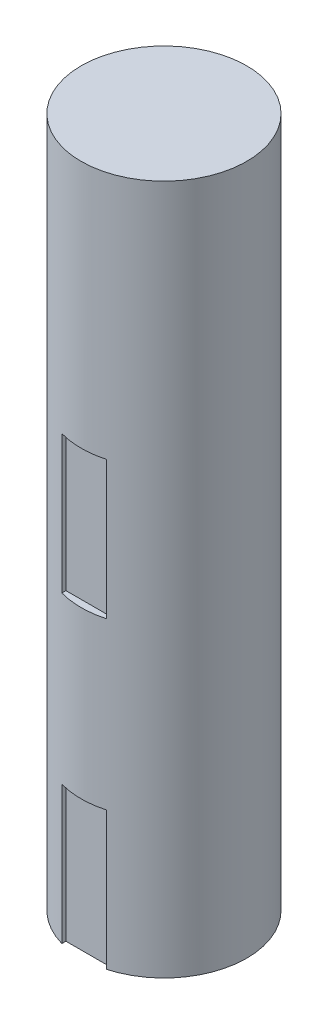
ISO-10303-21;
HEADER;
FILE_DESCRIPTION(('STEP AP214'),'2;1');
FILE_NAME('part.step','',(''),(''),'','','');
FILE_SCHEMA(('AUTOMOTIVE_DESIGN { 1 0 10303 214 1 1 1 1 }'));
ENDSEC;
DATA;
#1=APPLICATION_CONTEXT('core data for automotive mechanical design processes');
#2=APPLICATION_PROTOCOL_DEFINITION('international standard','automotive_design',2000,#1);
#3=PRODUCT_CONTEXT('',#1,'mechanical');
#4=PRODUCT('Part','Part','',(#3));
#5=PRODUCT_RELATED_PRODUCT_CATEGORY('part','',(#4));
#6=PRODUCT_DEFINITION_FORMATION('','',#4);
#7=PRODUCT_DEFINITION_CONTEXT('part definition',#1,'design');
#8=PRODUCT_DEFINITION('design','',#6,#7);
#9=PRODUCT_DEFINITION_SHAPE('','',#8);
#10=(LENGTH_UNIT() NAMED_UNIT(*) SI_UNIT(.MILLI.,.METRE.));
#11=(NAMED_UNIT(*) PLANE_ANGLE_UNIT() SI_UNIT($,.RADIAN.));
#12=(NAMED_UNIT(*) SI_UNIT($,.STERADIAN.) SOLID_ANGLE_UNIT());
#13=UNCERTAINTY_MEASURE_WITH_UNIT(LENGTH_MEASURE(1.E-05),#10,'distance_accuracy_value','');
#14=(GEOMETRIC_REPRESENTATION_CONTEXT(3) GLOBAL_UNCERTAINTY_ASSIGNED_CONTEXT((#13)) GLOBAL_UNIT_ASSIGNED_CONTEXT((#10,
#11,#12)) REPRESENTATION_CONTEXT('',''));
#15=CARTESIAN_POINT('',(0.,0.,0.));
#16=DIRECTION('',(0.,0.,1.));
#17=DIRECTION('',(1.,0.,0.));
#18=AXIS2_PLACEMENT_3D('',#15,#16,#17);
#19=CARTESIAN_POINT('',(0.,125.,0.));
#20=DIRECTION('',(0.,-1.,0.));
#21=DIRECTION('',(0.,0.,-1.));
#22=AXIS2_PLACEMENT_3D('',#19,#20,#21);
#23=CYLINDRICAL_SURFACE('',#22,30.);
#24=DIRECTION('',(0.,-1.,0.));
#25=VECTOR('',#24,1.);
#26=CARTESIAN_POINT('',(-8.09533569525371,125.,28.8871171974836));
#27=LINE('',#26,#25);
#28=CARTESIAN_POINT('',(-8.09533569525371,-75.,28.8871171974836));
#29=VERTEX_POINT('',#28);
#30=CARTESIAN_POINT('',(-8.09533569525371,-125.,28.8871171974836));
#31=VERTEX_POINT('',#30);
#32=EDGE_CURVE('E154',#29,#31,#27,.T.);
#33=ORIENTED_EDGE('',*,*,#32,.F.);
#34=CARTESIAN_POINT('',(0.,-75.,0.));
#35=DIRECTION('',(0.,-1.,0.));
#36=DIRECTION('',(0.,0.,-1.));
#37=AXIS2_PLACEMENT_3D('',#34,#35,#36);
#38=CIRCLE('',#37,30.);
#39=CARTESIAN_POINT('',(8.09533569525371,-75.,28.8871171974836));
#40=VERTEX_POINT('',#39);
#41=EDGE_CURVE('E11',#40,#29,#38,.T.);
#42=ORIENTED_EDGE('',*,*,#41,.F.);
#43=DIRECTION('',(0.,-1.,0.));
#44=VECTOR('',#43,1.);
#45=CARTESIAN_POINT('',(8.09533569525371,125.,28.8871171974836));
#46=LINE('',#45,#44);
#47=CARTESIAN_POINT('',(8.09533569525371,-125.,28.8871171974836));
#48=VERTEX_POINT('',#47);
#49=EDGE_CURVE('E150',#40,#48,#46,.T.);
#50=ORIENTED_EDGE('',*,*,#49,.T.);
#51=CARTESIAN_POINT('',(0.,-125.,0.));
#52=DIRECTION('',(0.,1.,0.));
#53=DIRECTION('',(0.,0.,1.));
#54=AXIS2_PLACEMENT_3D('',#51,#52,#53);
#55=CIRCLE('',#54,30.);
#56=EDGE_CURVE('E156',#48,#31,#55,.T.);
#57=ORIENTED_EDGE('',*,*,#56,.T.);
#58=EDGE_LOOP('',(#33,#42,#50,#57));
#59=FACE_BOUND('',#58,.T.);
#60=CARTESIAN_POINT('',(0.,125.,0.));
#61=DIRECTION('',(0.,1.,0.));
#62=DIRECTION('',(0.,0.,1.));
#63=AXIS2_PLACEMENT_3D('',#60,#61,#62);
#64=CIRCLE('',#63,30.);
#65=CARTESIAN_POINT('',(0.,125.,30.));
#66=VERTEX_POINT('',#65);
#67=EDGE_CURVE('E46',#66,#66,#64,.T.);
#68=ORIENTED_EDGE('',*,*,#67,.F.);
#69=EDGE_LOOP('',(#68));
#70=FACE_BOUND('',#69,.T.);
#71=CARTESIAN_POINT('',(0.,35.,0.));
#72=DIRECTION('',(0.,-1.,0.));
#73=DIRECTION('',(0.,0.,-1.));
#74=AXIS2_PLACEMENT_3D('',#71,#72,#73);
#75=CIRCLE('',#74,30.);
#76=CARTESIAN_POINT('',(8.09533569525371,35.,28.8871171974836));
#77=VERTEX_POINT('',#76);
#78=CARTESIAN_POINT('',(-8.0953356952537,35.,28.8871171974836));
#79=VERTEX_POINT('',#78);
#80=EDGE_CURVE('E114',#77,#79,#75,.T.);
#81=ORIENTED_EDGE('',*,*,#80,.F.);
#82=DIRECTION('',(0.,-1.,0.));
#83=VECTOR('',#82,1.);
#84=CARTESIAN_POINT('',(8.09533569525371,35.,28.8871171974836));
#85=LINE('',#84,#83);
#86=CARTESIAN_POINT('',(8.09533569525371,-15.,28.8871171974836));
#87=VERTEX_POINT('',#86);
#88=EDGE_CURVE('E144',#77,#87,#85,.T.);
#89=ORIENTED_EDGE('',*,*,#88,.T.);
#90=CARTESIAN_POINT('',(0.,-15.,0.));
#91=DIRECTION('',(0.,-1.,0.));
#92=DIRECTION('',(0.,0.,-1.));
#93=AXIS2_PLACEMENT_3D('',#90,#91,#92);
#94=CIRCLE('',#93,30.);
#95=CARTESIAN_POINT('',(-8.0953356952537,-15.,28.8871171974836));
#96=VERTEX_POINT('',#95);
#97=EDGE_CURVE('E125',#87,#96,#94,.T.);
#98=ORIENTED_EDGE('',*,*,#97,.T.);
#99=DIRECTION('',(0.,-1.,0.));
#100=VECTOR('',#99,1.);
#101=CARTESIAN_POINT('',(-8.0953356952537,35.,28.8871171974836));
#102=LINE('',#101,#100);
#103=EDGE_CURVE('E107',#79,#96,#102,.T.);
#104=ORIENTED_EDGE('',*,*,#103,.F.);
#105=EDGE_LOOP('',(#81,#89,#98,#104));
#106=FACE_BOUND('',#105,.T.);
#107=ADVANCED_FACE('F39',(#59,#70,#106),#23,.T.);
#108=CARTESIAN_POINT('',(0.,-125.,0.));
#109=DIRECTION('',(0.,1.,0.));
#110=DIRECTION('',(0.,0.,1.));
#111=AXIS2_PLACEMENT_3D('',#108,#109,#110);
#112=PLANE('',#111);
#113=DIRECTION('',(0.,0.,1.));
#114=VECTOR('',#113,1.);
#115=CARTESIAN_POINT('',(-8.09533569525371,-125.,0.));
#116=LINE('',#115,#114);
#117=CARTESIAN_POINT('',(-8.09533569525371,-125.,27.42));
#118=VERTEX_POINT('',#117);
#119=EDGE_CURVE('E61',#118,#31,#116,.T.);
#120=ORIENTED_EDGE('',*,*,#119,.T.);
#121=ORIENTED_EDGE('',*,*,#56,.F.);
#122=DIRECTION('',(0.,0.,1.));
#123=VECTOR('',#122,1.);
#124=CARTESIAN_POINT('',(8.09533569525371,-125.,0.));
#125=LINE('',#124,#123);
#126=CARTESIAN_POINT('',(8.09533569525371,-125.,27.42));
#127=VERTEX_POINT('',#126);
#128=EDGE_CURVE('E136',#127,#48,#125,.T.);
#129=ORIENTED_EDGE('',*,*,#128,.F.);
#130=DIRECTION('',(-1.,0.,0.));
#131=VECTOR('',#130,1.);
#132=CARTESIAN_POINT('',(0.,-125.,27.42));
#133=LINE('',#132,#131);
#134=EDGE_CURVE('E143',#127,#118,#133,.T.);
#135=ORIENTED_EDGE('',*,*,#134,.T.);
#136=EDGE_LOOP('',(#120,#121,#129,#135));
#137=FACE_BOUND('',#136,.T.);
#138=ADVANCED_FACE('F166',(#137),#112,.F.);
#139=CARTESIAN_POINT('',(0.,125.,0.));
#140=DIRECTION('',(0.,1.,0.));
#141=DIRECTION('',(0.,0.,1.));
#142=AXIS2_PLACEMENT_3D('',#139,#140,#141);
#143=PLANE('',#142);
#144=ORIENTED_EDGE('',*,*,#67,.T.);
#145=EDGE_LOOP('',(#144));
#146=FACE_BOUND('',#145,.T.);
#147=ADVANCED_FACE('F193',(#146),#143,.T.);
#148=CARTESIAN_POINT('',(0.,-75.,0.));
#149=DIRECTION('',(0.,-1.,0.));
#150=DIRECTION('',(0.,0.,-1.));
#151=AXIS2_PLACEMENT_3D('',#148,#149,#150);
#152=PLANE('',#151);
#153=ORIENTED_EDGE('',*,*,#41,.T.);
#154=DIRECTION('',(0.,0.,1.));
#155=VECTOR('',#154,1.);
#156=CARTESIAN_POINT('',(-8.09533569525371,-75.,0.));
#157=LINE('',#156,#155);
#158=CARTESIAN_POINT('',(-8.09533569525371,-75.,27.42));
#159=VERTEX_POINT('',#158);
#160=EDGE_CURVE('E132',#159,#29,#157,.T.);
#161=ORIENTED_EDGE('',*,*,#160,.F.);
#162=DIRECTION('',(-1.,0.,0.));
#163=VECTOR('',#162,1.);
#164=CARTESIAN_POINT('',(0.,-75.,27.42));
#165=LINE('',#164,#163);
#166=CARTESIAN_POINT('',(8.09533569525371,-75.,27.42));
#167=VERTEX_POINT('',#166);
#168=EDGE_CURVE('E135',#167,#159,#165,.T.);
#169=ORIENTED_EDGE('',*,*,#168,.F.);
#170=DIRECTION('',(0.,0.,1.));
#171=VECTOR('',#170,1.);
#172=CARTESIAN_POINT('',(8.09533569525371,-75.,0.));
#173=LINE('',#172,#171);
#174=EDGE_CURVE('E138',#167,#40,#173,.T.);
#175=ORIENTED_EDGE('',*,*,#174,.T.);
#176=EDGE_LOOP('',(#153,#161,#169,#175));
#177=FACE_BOUND('',#176,.T.);
#178=ADVANCED_FACE('F174',(#177),#152,.T.);
#179=CARTESIAN_POINT('',(-8.09533569525371,-75.,0.));
#180=DIRECTION('',(1.,0.,0.));
#181=DIRECTION('',(0.,0.,-1.));
#182=AXIS2_PLACEMENT_3D('',#179,#180,#181);
#183=PLANE('',#182);
#184=ORIENTED_EDGE('',*,*,#32,.T.);
#185=ORIENTED_EDGE('',*,*,#119,.F.);
#186=DIRECTION('',(0.,-1.,0.));
#187=VECTOR('',#186,1.);
#188=CARTESIAN_POINT('',(-8.09533569525371,-75.,27.42));
#189=LINE('',#188,#187);
#190=EDGE_CURVE('E141',#159,#118,#189,.T.);
#191=ORIENTED_EDGE('',*,*,#190,.F.);
#192=ORIENTED_EDGE('',*,*,#160,.T.);
#193=EDGE_LOOP('',(#184,#185,#191,#192));
#194=FACE_BOUND('',#193,.T.);
#195=ADVANCED_FACE('F172',(#194),#183,.T.);
#196=CARTESIAN_POINT('',(8.09533569525371,-75.,0.));
#197=DIRECTION('',(1.,0.,0.));
#198=DIRECTION('',(0.,0.,-1.));
#199=AXIS2_PLACEMENT_3D('',#196,#197,#198);
#200=PLANE('',#199);
#201=ORIENTED_EDGE('',*,*,#174,.F.);
#202=DIRECTION('',(0.,-1.,0.));
#203=VECTOR('',#202,1.);
#204=CARTESIAN_POINT('',(8.09533569525371,-75.,27.42));
#205=LINE('',#204,#203);
#206=EDGE_CURVE('E148',#167,#127,#205,.T.);
#207=ORIENTED_EDGE('',*,*,#206,.T.);
#208=ORIENTED_EDGE('',*,*,#128,.T.);
#209=ORIENTED_EDGE('',*,*,#49,.F.);
#210=EDGE_LOOP('',(#201,#207,#208,#209));
#211=FACE_BOUND('',#210,.T.);
#212=ADVANCED_FACE('F177',(#211),#200,.F.);
#213=CARTESIAN_POINT('',(0.,-75.,27.42));
#214=DIRECTION('',(0.,0.,1.));
#215=DIRECTION('',(1.,0.,0.));
#216=AXIS2_PLACEMENT_3D('',#213,#214,#215);
#217=PLANE('',#216);
#218=ORIENTED_EDGE('',*,*,#134,.F.);
#219=ORIENTED_EDGE('',*,*,#206,.F.);
#220=ORIENTED_EDGE('',*,*,#168,.T.);
#221=ORIENTED_EDGE('',*,*,#190,.T.);
#222=EDGE_LOOP('',(#218,#219,#220,#221));
#223=FACE_BOUND('',#222,.T.);
#224=ADVANCED_FACE('F169',(#223),#217,.T.);
#225=CARTESIAN_POINT('',(8.09533569525371,35.,27.42));
#226=DIRECTION('',(1.,0.,0.));
#227=DIRECTION('',(0.,0.,-1.));
#228=AXIS2_PLACEMENT_3D('',#225,#226,#227);
#229=PLANE('',#228);
#230=DIRECTION('',(0.,0.,1.));
#231=VECTOR('',#230,1.);
#232=CARTESIAN_POINT('',(8.09533569525371,-15.,27.42));
#233=LINE('',#232,#231);
#234=CARTESIAN_POINT('',(8.09533569525371,-15.,27.42));
#235=VERTEX_POINT('',#234);
#236=EDGE_CURVE('E123',#235,#87,#233,.T.);
#237=ORIENTED_EDGE('',*,*,#236,.T.);
#238=ORIENTED_EDGE('',*,*,#88,.F.);
#239=DIRECTION('',(0.,0.,1.));
#240=VECTOR('',#239,1.);
#241=CARTESIAN_POINT('',(8.09533569525371,35.,27.42));
#242=LINE('',#241,#240);
#243=CARTESIAN_POINT('',(8.09533569525371,35.,27.42));
#244=VERTEX_POINT('',#243);
#245=EDGE_CURVE('E120',#244,#77,#242,.T.);
#246=ORIENTED_EDGE('',*,*,#245,.F.);
#247=DIRECTION('',(0.,-1.,0.));
#248=VECTOR('',#247,1.);
#249=CARTESIAN_POINT('',(8.09533569525371,35.,27.42));
#250=LINE('',#249,#248);
#251=EDGE_CURVE('E127',#244,#235,#250,.T.);
#252=ORIENTED_EDGE('',*,*,#251,.T.);
#253=EDGE_LOOP('',(#237,#238,#246,#252));
#254=FACE_BOUND('',#253,.T.);
#255=ADVANCED_FACE('F184',(#254),#229,.F.);
#256=CARTESIAN_POINT('',(-8.09533569525371,35.,27.42));
#257=DIRECTION('',(0.,0.,-1.));
#258=DIRECTION('',(-1.,0.,0.));
#259=AXIS2_PLACEMENT_3D('',#256,#257,#258);
#260=PLANE('',#259);
#261=DIRECTION('',(1.,0.,0.));
#262=VECTOR('',#261,1.);
#263=CARTESIAN_POINT('',(-8.09533569525371,-15.,27.42));
#264=LINE('',#263,#262);
#265=CARTESIAN_POINT('',(-8.09533569525371,-15.,27.42));
#266=VERTEX_POINT('',#265);
#267=EDGE_CURVE('E287',#266,#235,#264,.T.);
#268=ORIENTED_EDGE('',*,*,#267,.T.);
#269=ORIENTED_EDGE('',*,*,#251,.F.);
#270=DIRECTION('',(1.,0.,0.));
#271=VECTOR('',#270,1.);
#272=CARTESIAN_POINT('',(-8.09533569525371,35.,27.42));
#273=LINE('',#272,#271);
#274=CARTESIAN_POINT('',(-8.09533569525371,35.,27.42));
#275=VERTEX_POINT('',#274);
#276=EDGE_CURVE('E113',#275,#244,#273,.T.);
#277=ORIENTED_EDGE('',*,*,#276,.F.);
#278=DIRECTION('',(0.,-1.,0.));
#279=VECTOR('',#278,1.);
#280=CARTESIAN_POINT('',(-8.09533569525371,35.,27.42));
#281=LINE('',#280,#279);
#282=EDGE_CURVE('E109',#275,#266,#281,.T.);
#283=ORIENTED_EDGE('',*,*,#282,.T.);
#284=EDGE_LOOP('',(#268,#269,#277,#283));
#285=FACE_BOUND('',#284,.T.);
#286=ADVANCED_FACE('F208',(#285),#260,.F.);
#287=CARTESIAN_POINT('',(-8.0953356952537,35.,28.8871171974836));
#288=DIRECTION('',(-1.,0.,0.));
#289=DIRECTION('',(0.,0.,1.));
#290=AXIS2_PLACEMENT_3D('',#287,#288,#289);
#291=PLANE('',#290);
#292=DIRECTION('',(0.,0.,-1.));
#293=VECTOR('',#292,1.);
#294=CARTESIAN_POINT('',(-8.0953356952537,-15.,28.8871171974836));
#295=LINE('',#294,#293);
#296=EDGE_CURVE('E53',#96,#266,#295,.T.);
#297=ORIENTED_EDGE('',*,*,#296,.T.);
#298=ORIENTED_EDGE('',*,*,#282,.F.);
#299=DIRECTION('',(0.,0.,-1.));
#300=VECTOR('',#299,1.);
#301=CARTESIAN_POINT('',(-8.0953356952537,35.,28.8871171974836));
#302=LINE('',#301,#300);
#303=EDGE_CURVE('E103',#79,#275,#302,.T.);
#304=ORIENTED_EDGE('',*,*,#303,.F.);
#305=ORIENTED_EDGE('',*,*,#103,.T.);
#306=EDGE_LOOP('',(#297,#298,#304,#305));
#307=FACE_BOUND('',#306,.T.);
#308=ADVANCED_FACE('F105',(#307),#291,.F.);
#309=CARTESIAN_POINT('',(0.,35.,0.));
#310=DIRECTION('',(0.,-1.,0.));
#311=DIRECTION('',(0.,0.,-1.));
#312=AXIS2_PLACEMENT_3D('',#309,#310,#311);
#313=PLANE('',#312);
#314=ORIENTED_EDGE('',*,*,#80,.T.);
#315=ORIENTED_EDGE('',*,*,#303,.T.);
#316=ORIENTED_EDGE('',*,*,#276,.T.);
#317=ORIENTED_EDGE('',*,*,#245,.T.);
#318=EDGE_LOOP('',(#314,#315,#316,#317));
#319=FACE_BOUND('',#318,.T.);
#320=ADVANCED_FACE('F118',(#319),#313,.T.);
#321=CARTESIAN_POINT('',(0.,-15.,0.));
#322=DIRECTION('',(0.,-1.,0.));
#323=DIRECTION('',(0.,0.,-1.));
#324=AXIS2_PLACEMENT_3D('',#321,#322,#323);
#325=PLANE('',#324);
#326=ORIENTED_EDGE('',*,*,#97,.F.);
#327=ORIENTED_EDGE('',*,*,#236,.F.);
#328=ORIENTED_EDGE('',*,*,#267,.F.);
#329=ORIENTED_EDGE('',*,*,#296,.F.);
#330=EDGE_LOOP('',(#326,#327,#328,#329));
#331=FACE_BOUND('',#330,.T.);
#332=ADVANCED_FACE('F214',(#331),#325,.F.);
#333=CLOSED_SHELL('',(#107,#138,#147,#178,#195,#212,#224,#255,#286,#308,#320,#332));
#334=MANIFOLD_SOLID_BREP('B2',#333);
#335=ADVANCED_BREP_SHAPE_REPRESENTATION('',(#18,#334),#14);
#336=SHAPE_DEFINITION_REPRESENTATION(#9,#335);
ENDSEC;
END-ISO-10303-21;
